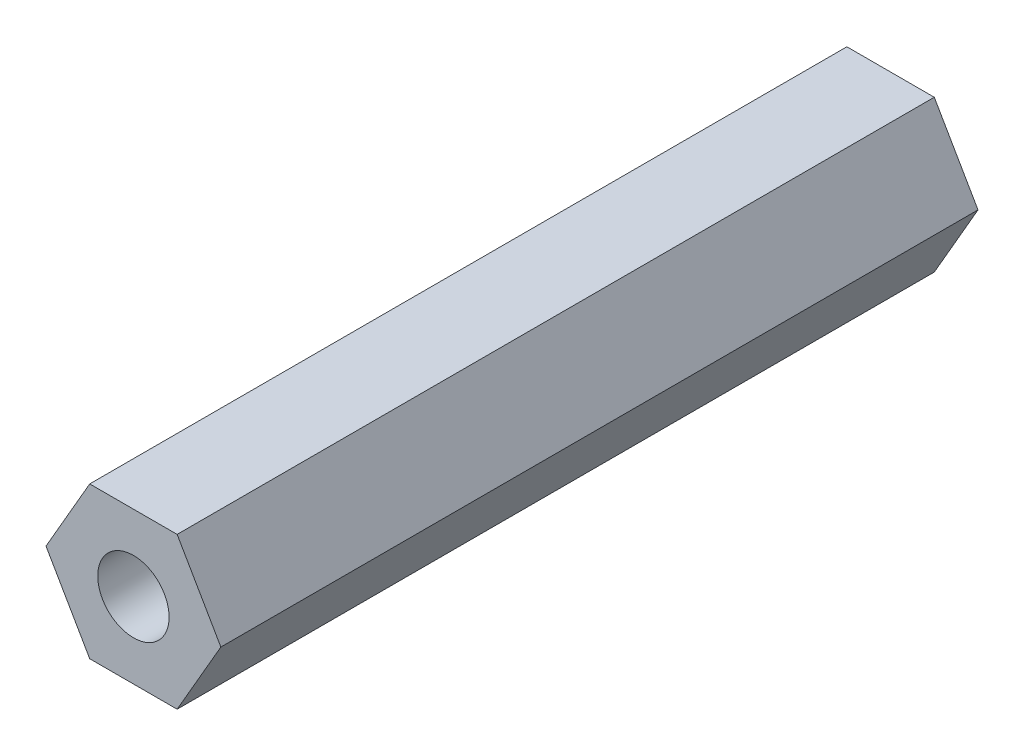
ISO-10303-21;
HEADER;
FILE_DESCRIPTION(('STEP AP214'),'2;1');
FILE_NAME('part.step','',(''),(''),'','','');
FILE_SCHEMA(('AUTOMOTIVE_DESIGN { 1 0 10303 214 1 1 1 1 }'));
ENDSEC;
DATA;
#1=APPLICATION_CONTEXT('core data for automotive mechanical design processes');
#2=APPLICATION_PROTOCOL_DEFINITION('international standard','automotive_design',2000,#1);
#3=PRODUCT_CONTEXT('',#1,'mechanical');
#4=PRODUCT('Part','Part','',(#3));
#5=PRODUCT_RELATED_PRODUCT_CATEGORY('part','',(#4));
#6=PRODUCT_DEFINITION_FORMATION('','',#4);
#7=PRODUCT_DEFINITION_CONTEXT('part definition',#1,'design');
#8=PRODUCT_DEFINITION('design','',#6,#7);
#9=PRODUCT_DEFINITION_SHAPE('','',#8);
#10=(LENGTH_UNIT() NAMED_UNIT(*) SI_UNIT(.MILLI.,.METRE.));
#11=(NAMED_UNIT(*) PLANE_ANGLE_UNIT() SI_UNIT($,.RADIAN.));
#12=(NAMED_UNIT(*) SI_UNIT($,.STERADIAN.) SOLID_ANGLE_UNIT());
#13=UNCERTAINTY_MEASURE_WITH_UNIT(LENGTH_MEASURE(1.E-05),#10,'distance_accuracy_value','');
#14=(GEOMETRIC_REPRESENTATION_CONTEXT(3) GLOBAL_UNCERTAINTY_ASSIGNED_CONTEXT((#13)) GLOBAL_UNIT_ASSIGNED_CONTEXT((#10,
#11,#12)) REPRESENTATION_CONTEXT('',''));
#15=CARTESIAN_POINT('',(0.,0.,0.));
#16=DIRECTION('',(0.,0.,1.));
#17=DIRECTION('',(1.,0.,0.));
#18=AXIS2_PLACEMENT_3D('',#15,#16,#17);
#19=CARTESIAN_POINT('',(4.04145188432738,0.,35.));
#20=DIRECTION('',(-0.866025403784438,-0.5,0.));
#21=DIRECTION('',(0.5,-0.866025403784438,0.));
#22=AXIS2_PLACEMENT_3D('',#19,#20,#21);
#23=PLANE('',#22);
#24=DIRECTION('',(0.,0.,-1.));
#25=VECTOR('',#24,1.);
#26=CARTESIAN_POINT('',(2.02072594216369,3.5,35.));
#27=LINE('',#26,#25);
#28=CARTESIAN_POINT('',(2.02072594216369,3.5,0.));
#29=VERTEX_POINT('',#28);
#30=CARTESIAN_POINT('',(2.02072594216369,3.5,35.));
#31=VERTEX_POINT('',#30);
#32=EDGE_CURVE('E83',#29,#31,#27,.F.);
#33=ORIENTED_EDGE('',*,*,#32,.T.);
#34=DIRECTION('',(-0.5,0.866025403784438,0.));
#35=VECTOR('',#34,1.);
#36=CARTESIAN_POINT('',(4.04145188432738,0.,35.));
#37=LINE('',#36,#35);
#38=CARTESIAN_POINT('',(4.04145188432738,0.,35.));
#39=VERTEX_POINT('',#38);
#40=EDGE_CURVE('E79',#39,#31,#37,.T.);
#41=ORIENTED_EDGE('',*,*,#40,.F.);
#42=DIRECTION('',(0.,0.,1.));
#43=VECTOR('',#42,1.);
#44=CARTESIAN_POINT('',(4.04145188432738,0.,35.));
#45=LINE('',#44,#43);
#46=CARTESIAN_POINT('',(4.04145188432738,0.,0.));
#47=VERTEX_POINT('',#46);
#48=EDGE_CURVE('E67',#39,#47,#45,.F.);
#49=ORIENTED_EDGE('',*,*,#48,.T.);
#50=DIRECTION('',(-0.5,0.866025403784438,0.));
#51=VECTOR('',#50,1.);
#52=CARTESIAN_POINT('',(4.04145188432738,0.,0.));
#53=LINE('',#52,#51);
#54=EDGE_CURVE('E116',#47,#29,#53,.T.);
#55=ORIENTED_EDGE('',*,*,#54,.T.);
#56=EDGE_LOOP('',(#33,#41,#49,#55));
#57=FACE_BOUND('',#56,.T.);
#58=ADVANCED_FACE('F16',(#57),#23,.F.);
#59=CARTESIAN_POINT('',(2.02072594216369,3.5,35.));
#60=DIRECTION('',(0.,-1.,0.));
#61=DIRECTION('',(0.,0.,-1.));
#62=AXIS2_PLACEMENT_3D('',#59,#60,#61);
#63=PLANE('',#62);
#64=DIRECTION('',(0.,0.,1.));
#65=VECTOR('',#64,1.);
#66=CARTESIAN_POINT('',(-2.02072594216369,3.5,35.));
#67=LINE('',#66,#65);
#68=CARTESIAN_POINT('',(-2.02072594216369,3.5,0.));
#69=VERTEX_POINT('',#68);
#70=CARTESIAN_POINT('',(-2.02072594216369,3.5,35.));
#71=VERTEX_POINT('',#70);
#72=EDGE_CURVE('E98',#69,#71,#67,.T.);
#73=ORIENTED_EDGE('',*,*,#72,.T.);
#74=DIRECTION('',(1.,0.,0.));
#75=VECTOR('',#74,1.);
#76=CARTESIAN_POINT('',(0.,3.5,35.));
#77=LINE('',#76,#75);
#78=EDGE_CURVE('E85',#31,#71,#77,.F.);
#79=ORIENTED_EDGE('',*,*,#78,.F.);
#80=ORIENTED_EDGE('',*,*,#32,.F.);
#81=DIRECTION('',(1.,0.,0.));
#82=VECTOR('',#81,1.);
#83=CARTESIAN_POINT('',(0.,3.5,0.));
#84=LINE('',#83,#82);
#85=EDGE_CURVE('E106',#29,#69,#84,.F.);
#86=ORIENTED_EDGE('',*,*,#85,.T.);
#87=EDGE_LOOP('',(#73,#79,#80,#86));
#88=FACE_BOUND('',#87,.T.);
#89=ADVANCED_FACE('F104',(#88),#63,.F.);
#90=CARTESIAN_POINT('',(-2.02072594216369,3.5,35.));
#91=DIRECTION('',(0.866025403784439,-0.499999999999999,0.));
#92=DIRECTION('',(0.499999999999999,0.866025403784439,0.));
#93=AXIS2_PLACEMENT_3D('',#90,#91,#92);
#94=PLANE('',#93);
#95=DIRECTION('',(0.,0.,1.));
#96=VECTOR('',#95,1.);
#97=CARTESIAN_POINT('',(-4.04145188432738,0.,35.));
#98=LINE('',#97,#96);
#99=CARTESIAN_POINT('',(-4.04145188432738,0.,0.));
#100=VERTEX_POINT('',#99);
#101=CARTESIAN_POINT('',(-4.04145188432738,0.,35.));
#102=VERTEX_POINT('',#101);
#103=EDGE_CURVE('E95',#100,#102,#98,.T.);
#104=ORIENTED_EDGE('',*,*,#103,.T.);
#105=DIRECTION('',(-0.499999999999999,-0.866025403784439,0.));
#106=VECTOR('',#105,1.);
#107=CARTESIAN_POINT('',(-2.02072594216369,3.5,35.));
#108=LINE('',#107,#106);
#109=EDGE_CURVE('E87',#71,#102,#108,.T.);
#110=ORIENTED_EDGE('',*,*,#109,.F.);
#111=ORIENTED_EDGE('',*,*,#72,.F.);
#112=DIRECTION('',(-0.499999999999999,-0.866025403784439,0.));
#113=VECTOR('',#112,1.);
#114=CARTESIAN_POINT('',(-2.02072594216369,3.5,0.));
#115=LINE('',#114,#113);
#116=EDGE_CURVE('E119',#69,#100,#115,.T.);
#117=ORIENTED_EDGE('',*,*,#116,.T.);
#118=EDGE_LOOP('',(#104,#110,#111,#117));
#119=FACE_BOUND('',#118,.T.);
#120=ADVANCED_FACE('F110',(#119),#94,.F.);
#121=CARTESIAN_POINT('',(-4.04145188432738,0.,35.));
#122=DIRECTION('',(0.866025403784438,0.5,0.));
#123=DIRECTION('',(-0.5,0.866025403784438,0.));
#124=AXIS2_PLACEMENT_3D('',#121,#122,#123);
#125=PLANE('',#124);
#126=DIRECTION('',(0.,0.,1.));
#127=VECTOR('',#126,1.);
#128=CARTESIAN_POINT('',(-2.02072594216369,-3.5,35.));
#129=LINE('',#128,#127);
#130=CARTESIAN_POINT('',(-2.02072594216369,-3.5,0.));
#131=VERTEX_POINT('',#130);
#132=CARTESIAN_POINT('',(-2.02072594216369,-3.5,35.));
#133=VERTEX_POINT('',#132);
#134=EDGE_CURVE('E92',#131,#133,#129,.T.);
#135=ORIENTED_EDGE('',*,*,#134,.T.);
#136=DIRECTION('',(0.5,-0.866025403784438,0.));
#137=VECTOR('',#136,1.);
#138=CARTESIAN_POINT('',(-4.04145188432738,0.,35.));
#139=LINE('',#138,#137);
#140=EDGE_CURVE('E112',#102,#133,#139,.T.);
#141=ORIENTED_EDGE('',*,*,#140,.F.);
#142=ORIENTED_EDGE('',*,*,#103,.F.);
#143=DIRECTION('',(0.5,-0.866025403784438,0.));
#144=VECTOR('',#143,1.);
#145=CARTESIAN_POINT('',(-4.04145188432738,0.,0.));
#146=LINE('',#145,#144);
#147=EDGE_CURVE('E121',#100,#131,#146,.T.);
#148=ORIENTED_EDGE('',*,*,#147,.T.);
#149=EDGE_LOOP('',(#135,#141,#142,#148));
#150=FACE_BOUND('',#149,.T.);
#151=ADVANCED_FACE('F151',(#150),#125,.F.);
#152=CARTESIAN_POINT('',(-2.02072594216369,-3.5,35.));
#153=DIRECTION('',(0.,1.,0.));
#154=DIRECTION('',(-1.,0.,0.));
#155=AXIS2_PLACEMENT_3D('',#152,#153,#154);
#156=PLANE('',#155);
#157=DIRECTION('',(0.,0.,1.));
#158=VECTOR('',#157,1.);
#159=CARTESIAN_POINT('',(2.02072594216369,-3.5,35.));
#160=LINE('',#159,#158);
#161=CARTESIAN_POINT('',(2.02072594216369,-3.5,0.));
#162=VERTEX_POINT('',#161);
#163=CARTESIAN_POINT('',(2.02072594216369,-3.5,35.));
#164=VERTEX_POINT('',#163);
#165=EDGE_CURVE('E32',#162,#164,#160,.T.);
#166=ORIENTED_EDGE('',*,*,#165,.T.);
#167=DIRECTION('',(1.,0.,0.));
#168=VECTOR('',#167,1.);
#169=CARTESIAN_POINT('',(0.,-3.5,35.));
#170=LINE('',#169,#168);
#171=EDGE_CURVE('E81',#133,#164,#170,.T.);
#172=ORIENTED_EDGE('',*,*,#171,.F.);
#173=ORIENTED_EDGE('',*,*,#134,.F.);
#174=DIRECTION('',(1.,0.,0.));
#175=VECTOR('',#174,1.);
#176=CARTESIAN_POINT('',(0.,-3.5,0.));
#177=LINE('',#176,#175);
#178=EDGE_CURVE('E124',#131,#162,#177,.T.);
#179=ORIENTED_EDGE('',*,*,#178,.T.);
#180=EDGE_LOOP('',(#166,#172,#173,#179));
#181=FACE_BOUND('',#180,.T.);
#182=ADVANCED_FACE('F148',(#181),#156,.F.);
#183=CARTESIAN_POINT('',(2.02072594216369,-3.5,35.));
#184=DIRECTION('',(-0.866025403784439,0.499999999999999,0.));
#185=DIRECTION('',(-0.499999999999999,-0.866025403784439,0.));
#186=AXIS2_PLACEMENT_3D('',#183,#184,#185);
#187=PLANE('',#186);
#188=ORIENTED_EDGE('',*,*,#48,.F.);
#189=DIRECTION('',(0.5,0.866025403784439,0.));
#190=VECTOR('',#189,1.);
#191=CARTESIAN_POINT('',(2.02072594216369,-3.5,35.));
#192=LINE('',#191,#190);
#193=EDGE_CURVE('E70',#164,#39,#192,.T.);
#194=ORIENTED_EDGE('',*,*,#193,.F.);
#195=ORIENTED_EDGE('',*,*,#165,.F.);
#196=DIRECTION('',(0.5,0.866025403784439,0.));
#197=VECTOR('',#196,1.);
#198=CARTESIAN_POINT('',(2.02072594216369,-3.5,0.));
#199=LINE('',#198,#197);
#200=EDGE_CURVE('E71',#162,#47,#199,.T.);
#201=ORIENTED_EDGE('',*,*,#200,.T.);
#202=EDGE_LOOP('',(#188,#194,#195,#201));
#203=FACE_BOUND('',#202,.T.);
#204=ADVANCED_FACE('F69',(#203),#187,.F.);
#205=CARTESIAN_POINT('',(0.,0.,35.));
#206=DIRECTION('',(0.,0.,1.));
#207=DIRECTION('',(1.,0.,0.));
#208=AXIS2_PLACEMENT_3D('',#205,#206,#207);
#209=PLANE('',#208);
#210=ORIENTED_EDGE('',*,*,#140,.T.);
#211=ORIENTED_EDGE('',*,*,#171,.T.);
#212=ORIENTED_EDGE('',*,*,#193,.T.);
#213=ORIENTED_EDGE('',*,*,#40,.T.);
#214=ORIENTED_EDGE('',*,*,#78,.T.);
#215=ORIENTED_EDGE('',*,*,#109,.T.);
#216=EDGE_LOOP('',(#210,#211,#212,#213,#214,#215));
#217=FACE_BOUND('',#216,.T.);
#218=CARTESIAN_POINT('',(0.,0.,35.));
#219=DIRECTION('',(0.,0.,1.));
#220=DIRECTION('',(1.,0.,0.));
#221=AXIS2_PLACEMENT_3D('',#218,#219,#220);
#222=CIRCLE('',#221,1.64999999999999);
#223=CARTESIAN_POINT('',(1.64999999999999,0.,35.));
#224=VERTEX_POINT('',#223);
#225=EDGE_CURVE('E19',#224,#224,#222,.F.);
#226=ORIENTED_EDGE('',*,*,#225,.T.);
#227=EDGE_LOOP('',(#226));
#228=FACE_BOUND('',#227,.T.);
#229=ADVANCED_FACE('F77',(#217,#228),#209,.T.);
#230=CARTESIAN_POINT('',(0.,0.,0.));
#231=DIRECTION('',(0.,0.,1.));
#232=DIRECTION('',(1.,0.,0.));
#233=AXIS2_PLACEMENT_3D('',#230,#231,#232);
#234=PLANE('',#233);
#235=ORIENTED_EDGE('',*,*,#178,.F.);
#236=ORIENTED_EDGE('',*,*,#147,.F.);
#237=ORIENTED_EDGE('',*,*,#116,.F.);
#238=ORIENTED_EDGE('',*,*,#85,.F.);
#239=ORIENTED_EDGE('',*,*,#54,.F.);
#240=ORIENTED_EDGE('',*,*,#200,.F.);
#241=EDGE_LOOP('',(#235,#236,#237,#238,#239,#240));
#242=FACE_BOUND('',#241,.T.);
#243=CARTESIAN_POINT('',(0.,0.,0.));
#244=DIRECTION('',(0.,0.,1.));
#245=DIRECTION('',(1.,0.,0.));
#246=AXIS2_PLACEMENT_3D('',#243,#244,#245);
#247=CIRCLE('',#246,1.64999999999999);
#248=CARTESIAN_POINT('',(1.64999999999999,0.,0.));
#249=VERTEX_POINT('',#248);
#250=EDGE_CURVE('E11',#249,#249,#247,.T.);
#251=ORIENTED_EDGE('',*,*,#250,.T.);
#252=EDGE_LOOP('',(#251));
#253=FACE_BOUND('',#252,.T.);
#254=ADVANCED_FACE('F132',(#242,#253),#234,.F.);
#255=CARTESIAN_POINT('',(0.,0.,35.));
#256=DIRECTION('',(0.,0.,1.));
#257=DIRECTION('',(1.,0.,0.));
#258=AXIS2_PLACEMENT_3D('',#255,#256,#257);
#259=CYLINDRICAL_SURFACE('',#258,1.64999999999999);
#260=ORIENTED_EDGE('',*,*,#225,.F.);
#261=EDGE_LOOP('',(#260));
#262=FACE_BOUND('',#261,.T.);
#263=ORIENTED_EDGE('',*,*,#250,.F.);
#264=EDGE_LOOP('',(#263));
#265=FACE_BOUND('',#264,.T.);
#266=ADVANCED_FACE('F129',(#262,#265),#259,.F.);
#267=CLOSED_SHELL('',(#58,#89,#120,#151,#182,#204,#229,#254,#266));
#268=MANIFOLD_SOLID_BREP('B1',#267);
#269=ADVANCED_BREP_SHAPE_REPRESENTATION('',(#18,#268),#14);
#270=SHAPE_DEFINITION_REPRESENTATION(#9,#269);
ENDSEC;
END-ISO-10303-21;
